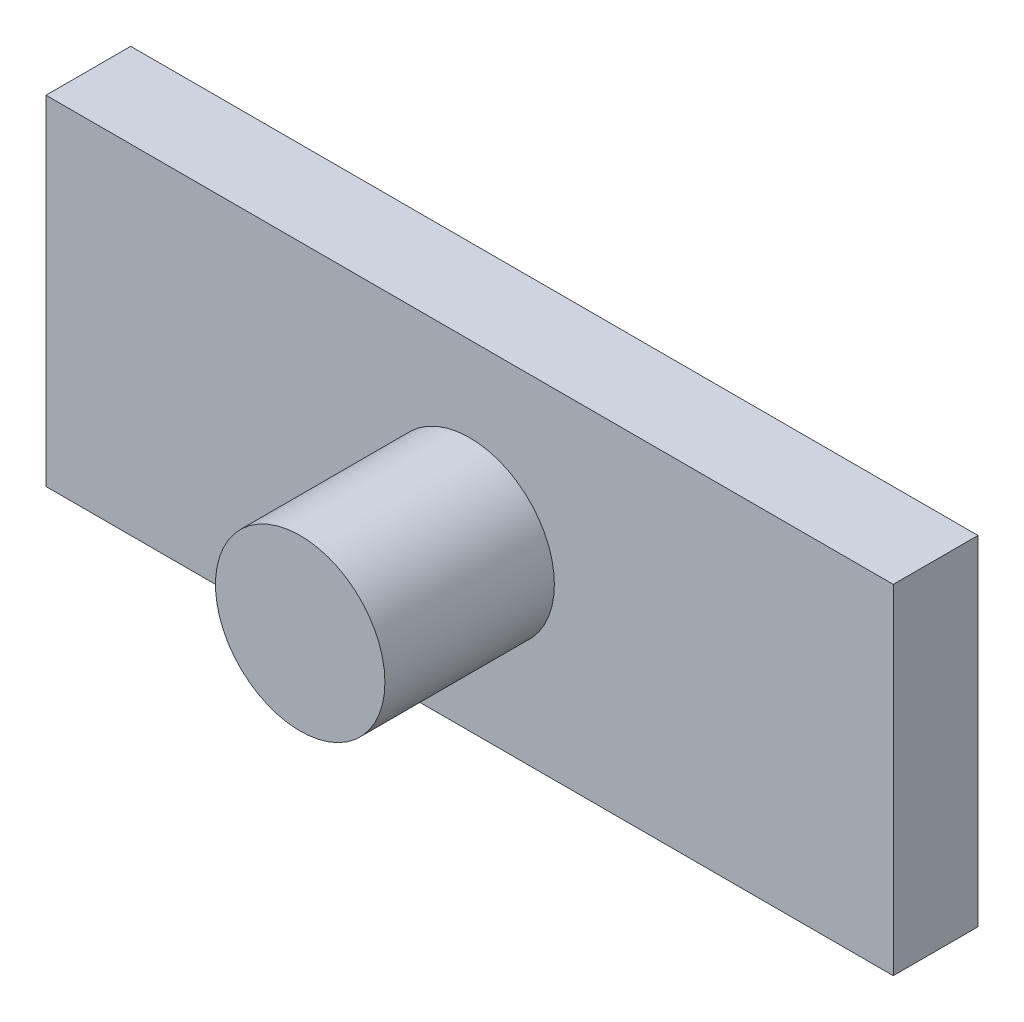
ISO-10303-21;
HEADER;
FILE_DESCRIPTION(('STEP AP214'),'2;1');
FILE_NAME('part.step','',(''),(''),'','','');
FILE_SCHEMA(('AUTOMOTIVE_DESIGN { 1 0 10303 214 1 1 1 1 }'));
ENDSEC;
DATA;
#1=APPLICATION_CONTEXT('core data for automotive mechanical design processes');
#2=APPLICATION_PROTOCOL_DEFINITION('international standard','automotive_design',2000,#1);
#3=PRODUCT_CONTEXT('',#1,'mechanical');
#4=PRODUCT('Part','Part','',(#3));
#5=PRODUCT_RELATED_PRODUCT_CATEGORY('part','',(#4));
#6=PRODUCT_DEFINITION_FORMATION('','',#4);
#7=PRODUCT_DEFINITION_CONTEXT('part definition',#1,'design');
#8=PRODUCT_DEFINITION('design','',#6,#7);
#9=PRODUCT_DEFINITION_SHAPE('','',#8);
#10=(LENGTH_UNIT() NAMED_UNIT(*) SI_UNIT(.MILLI.,.METRE.));
#11=(NAMED_UNIT(*) PLANE_ANGLE_UNIT() SI_UNIT($,.RADIAN.));
#12=(NAMED_UNIT(*) SI_UNIT($,.STERADIAN.) SOLID_ANGLE_UNIT());
#13=UNCERTAINTY_MEASURE_WITH_UNIT(LENGTH_MEASURE(1.E-05),#10,'distance_accuracy_value','');
#14=(GEOMETRIC_REPRESENTATION_CONTEXT(3) GLOBAL_UNCERTAINTY_ASSIGNED_CONTEXT((#13)) GLOBAL_UNIT_ASSIGNED_CONTEXT((#10,
#11,#12)) REPRESENTATION_CONTEXT('',''));
#15=CARTESIAN_POINT('',(0.,0.,0.));
#16=DIRECTION('',(0.,0.,1.));
#17=DIRECTION('',(1.,0.,0.));
#18=AXIS2_PLACEMENT_3D('',#15,#16,#17);
#19=CARTESIAN_POINT('',(50.,20.,10.));
#20=DIRECTION('',(-1.,0.,0.));
#21=DIRECTION('',(0.,0.,1.));
#22=AXIS2_PLACEMENT_3D('',#19,#20,#21);
#23=PLANE('',#22);
#24=DIRECTION('',(0.,1.,0.));
#25=VECTOR('',#24,1.);
#26=CARTESIAN_POINT('',(50.,20.,0.));
#27=LINE('',#26,#25);
#28=CARTESIAN_POINT('',(50.,-20.,0.));
#29=VERTEX_POINT('',#28);
#30=CARTESIAN_POINT('',(50.,20.,0.));
#31=VERTEX_POINT('',#30);
#32=EDGE_CURVE('E102',#29,#31,#27,.T.);
#33=ORIENTED_EDGE('',*,*,#32,.T.);
#34=DIRECTION('',(0.,0.,-1.));
#35=VECTOR('',#34,1.);
#36=CARTESIAN_POINT('',(50.,20.,10.));
#37=LINE('',#36,#35);
#38=CARTESIAN_POINT('',(50.,20.,10.));
#39=VERTEX_POINT('',#38);
#40=EDGE_CURVE('E39',#39,#31,#37,.T.);
#41=ORIENTED_EDGE('',*,*,#40,.F.);
#42=DIRECTION('',(0.,1.,0.));
#43=VECTOR('',#42,1.);
#44=CARTESIAN_POINT('',(50.,20.,10.));
#45=LINE('',#44,#43);
#46=CARTESIAN_POINT('',(50.,-20.,10.));
#47=VERTEX_POINT('',#46);
#48=EDGE_CURVE('E89',#47,#39,#45,.T.);
#49=ORIENTED_EDGE('',*,*,#48,.F.);
#50=DIRECTION('',(0.,0.,-1.));
#51=VECTOR('',#50,1.);
#52=CARTESIAN_POINT('',(50.,-20.,10.));
#53=LINE('',#52,#51);
#54=EDGE_CURVE('E98',#47,#29,#53,.T.);
#55=ORIENTED_EDGE('',*,*,#54,.T.);
#56=EDGE_LOOP('',(#33,#41,#49,#55));
#57=FACE_BOUND('',#56,.T.);
#58=ADVANCED_FACE('F36',(#57),#23,.F.);
#59=CARTESIAN_POINT('',(-50.,20.,10.));
#60=DIRECTION('',(0.,-1.,0.));
#61=DIRECTION('',(0.,0.,-1.));
#62=AXIS2_PLACEMENT_3D('',#59,#60,#61);
#63=PLANE('',#62);
#64=DIRECTION('',(-1.,0.,0.));
#65=VECTOR('',#64,1.);
#66=CARTESIAN_POINT('',(-50.,20.,0.));
#67=LINE('',#66,#65);
#68=CARTESIAN_POINT('',(-50.,20.,0.));
#69=VERTEX_POINT('',#68);
#70=EDGE_CURVE('E94',#31,#69,#67,.T.);
#71=ORIENTED_EDGE('',*,*,#70,.T.);
#72=DIRECTION('',(0.,0.,-1.));
#73=VECTOR('',#72,1.);
#74=CARTESIAN_POINT('',(-50.,20.,10.));
#75=LINE('',#74,#73);
#76=CARTESIAN_POINT('',(-50.,20.,10.));
#77=VERTEX_POINT('',#76);
#78=EDGE_CURVE('E92',#77,#69,#75,.T.);
#79=ORIENTED_EDGE('',*,*,#78,.F.);
#80=DIRECTION('',(-1.,0.,0.));
#81=VECTOR('',#80,1.);
#82=CARTESIAN_POINT('',(-50.,20.,10.));
#83=LINE('',#82,#81);
#84=EDGE_CURVE('E84',#39,#77,#83,.T.);
#85=ORIENTED_EDGE('',*,*,#84,.F.);
#86=ORIENTED_EDGE('',*,*,#40,.T.);
#87=EDGE_LOOP('',(#71,#79,#85,#86));
#88=FACE_BOUND('',#87,.T.);
#89=ADVANCED_FACE('F93',(#88),#63,.F.);
#90=CARTESIAN_POINT('',(-50.,20.,10.));
#91=DIRECTION('',(1.,0.,0.));
#92=DIRECTION('',(0.,0.,-1.));
#93=AXIS2_PLACEMENT_3D('',#90,#91,#92);
#94=PLANE('',#93);
#95=DIRECTION('',(0.,-1.,0.));
#96=VECTOR('',#95,1.);
#97=CARTESIAN_POINT('',(-50.,20.,0.));
#98=LINE('',#97,#96);
#99=CARTESIAN_POINT('',(-50.,-20.,0.));
#100=VERTEX_POINT('',#99);
#101=EDGE_CURVE('E70',#69,#100,#98,.T.);
#102=ORIENTED_EDGE('',*,*,#101,.T.);
#103=DIRECTION('',(0.,0.,-1.));
#104=VECTOR('',#103,1.);
#105=CARTESIAN_POINT('',(-50.,-20.,10.));
#106=LINE('',#105,#104);
#107=CARTESIAN_POINT('',(-50.,-20.,10.));
#108=VERTEX_POINT('',#107);
#109=EDGE_CURVE('E95',#108,#100,#106,.T.);
#110=ORIENTED_EDGE('',*,*,#109,.F.);
#111=DIRECTION('',(0.,-1.,0.));
#112=VECTOR('',#111,1.);
#113=CARTESIAN_POINT('',(-50.,20.,10.));
#114=LINE('',#113,#112);
#115=EDGE_CURVE('E87',#77,#108,#114,.T.);
#116=ORIENTED_EDGE('',*,*,#115,.F.);
#117=ORIENTED_EDGE('',*,*,#78,.T.);
#118=EDGE_LOOP('',(#102,#110,#116,#117));
#119=FACE_BOUND('',#118,.T.);
#120=ADVANCED_FACE('F96',(#119),#94,.F.);
#121=CARTESIAN_POINT('',(-50.,-20.,10.));
#122=DIRECTION('',(0.,1.,0.));
#123=DIRECTION('',(0.,0.,1.));
#124=AXIS2_PLACEMENT_3D('',#121,#122,#123);
#125=PLANE('',#124);
#126=DIRECTION('',(1.,0.,0.));
#127=VECTOR('',#126,1.);
#128=CARTESIAN_POINT('',(-50.,-20.,0.));
#129=LINE('',#128,#127);
#130=EDGE_CURVE('E76',#100,#29,#129,.T.);
#131=ORIENTED_EDGE('',*,*,#130,.T.);
#132=ORIENTED_EDGE('',*,*,#54,.F.);
#133=DIRECTION('',(1.,0.,0.));
#134=VECTOR('',#133,1.);
#135=CARTESIAN_POINT('',(-50.,-20.,10.));
#136=LINE('',#135,#134);
#137=EDGE_CURVE('E53',#108,#47,#136,.T.);
#138=ORIENTED_EDGE('',*,*,#137,.F.);
#139=ORIENTED_EDGE('',*,*,#109,.T.);
#140=EDGE_LOOP('',(#131,#132,#138,#139));
#141=FACE_BOUND('',#140,.T.);
#142=ADVANCED_FACE('F110',(#141),#125,.F.);
#143=CARTESIAN_POINT('',(0.,0.,10.));
#144=DIRECTION('',(0.,0.,1.));
#145=DIRECTION('',(1.,0.,0.));
#146=AXIS2_PLACEMENT_3D('',#143,#144,#145);
#147=PLANE('',#146);
#148=CARTESIAN_POINT('',(0.,0.,10.));
#149=DIRECTION('',(0.,0.,1.));
#150=DIRECTION('',(1.,0.,0.));
#151=AXIS2_PLACEMENT_3D('',#148,#149,#150);
#152=CIRCLE('',#151,10.);
#153=CARTESIAN_POINT('',(10.,0.,10.));
#154=VERTEX_POINT('',#153);
#155=EDGE_CURVE('E11',#154,#154,#152,.T.);
#156=ORIENTED_EDGE('',*,*,#155,.F.);
#157=EDGE_LOOP('',(#156));
#158=FACE_BOUND('',#157,.T.);
#159=ORIENTED_EDGE('',*,*,#48,.T.);
#160=ORIENTED_EDGE('',*,*,#84,.T.);
#161=ORIENTED_EDGE('',*,*,#115,.T.);
#162=ORIENTED_EDGE('',*,*,#137,.T.);
#163=EDGE_LOOP('',(#159,#160,#161,#162));
#164=FACE_BOUND('',#163,.T.);
#165=ADVANCED_FACE('F85',(#158,#164),#147,.T.);
#166=CARTESIAN_POINT('',(0.,0.,0.));
#167=DIRECTION('',(0.,0.,1.));
#168=DIRECTION('',(1.,0.,0.));
#169=AXIS2_PLACEMENT_3D('',#166,#167,#168);
#170=PLANE('',#169);
#171=ORIENTED_EDGE('',*,*,#32,.F.);
#172=ORIENTED_EDGE('',*,*,#130,.F.);
#173=ORIENTED_EDGE('',*,*,#101,.F.);
#174=ORIENTED_EDGE('',*,*,#70,.F.);
#175=EDGE_LOOP('',(#171,#172,#173,#174));
#176=FACE_BOUND('',#175,.T.);
#177=ADVANCED_FACE('F113',(#176),#170,.F.);
#178=CARTESIAN_POINT('',(0.,0.,30.));
#179=DIRECTION('',(0.,0.,-1.));
#180=DIRECTION('',(-1.,0.,0.));
#181=AXIS2_PLACEMENT_3D('',#178,#179,#180);
#182=CYLINDRICAL_SURFACE('',#181,10.);
#183=CARTESIAN_POINT('',(0.,0.,30.));
#184=DIRECTION('',(0.,0.,1.));
#185=DIRECTION('',(1.,0.,0.));
#186=AXIS2_PLACEMENT_3D('',#183,#184,#185);
#187=CIRCLE('',#186,10.);
#188=CARTESIAN_POINT('',(10.,0.,30.));
#189=VERTEX_POINT('',#188);
#190=EDGE_CURVE('E105',#189,#189,#187,.T.);
#191=ORIENTED_EDGE('',*,*,#190,.F.);
#192=EDGE_LOOP('',(#191));
#193=FACE_BOUND('',#192,.T.);
#194=ORIENTED_EDGE('',*,*,#155,.T.);
#195=EDGE_LOOP('',(#194));
#196=FACE_BOUND('',#195,.T.);
#197=ADVANCED_FACE('F121',(#193,#196),#182,.T.);
#198=CARTESIAN_POINT('',(0.,0.,30.));
#199=DIRECTION('',(0.,0.,1.));
#200=DIRECTION('',(1.,0.,0.));
#201=AXIS2_PLACEMENT_3D('',#198,#199,#200);
#202=PLANE('',#201);
#203=ORIENTED_EDGE('',*,*,#190,.T.);
#204=EDGE_LOOP('',(#203));
#205=FACE_BOUND('',#204,.T.);
#206=ADVANCED_FACE('F119',(#205),#202,.T.);
#207=CLOSED_SHELL('',(#58,#89,#120,#142,#165,#177,#197,#206));
#208=MANIFOLD_SOLID_BREP('B2',#207);
#209=ADVANCED_BREP_SHAPE_REPRESENTATION('',(#18,#208),#14);
#210=SHAPE_DEFINITION_REPRESENTATION(#9,#209);
ENDSEC;
END-ISO-10303-21;
